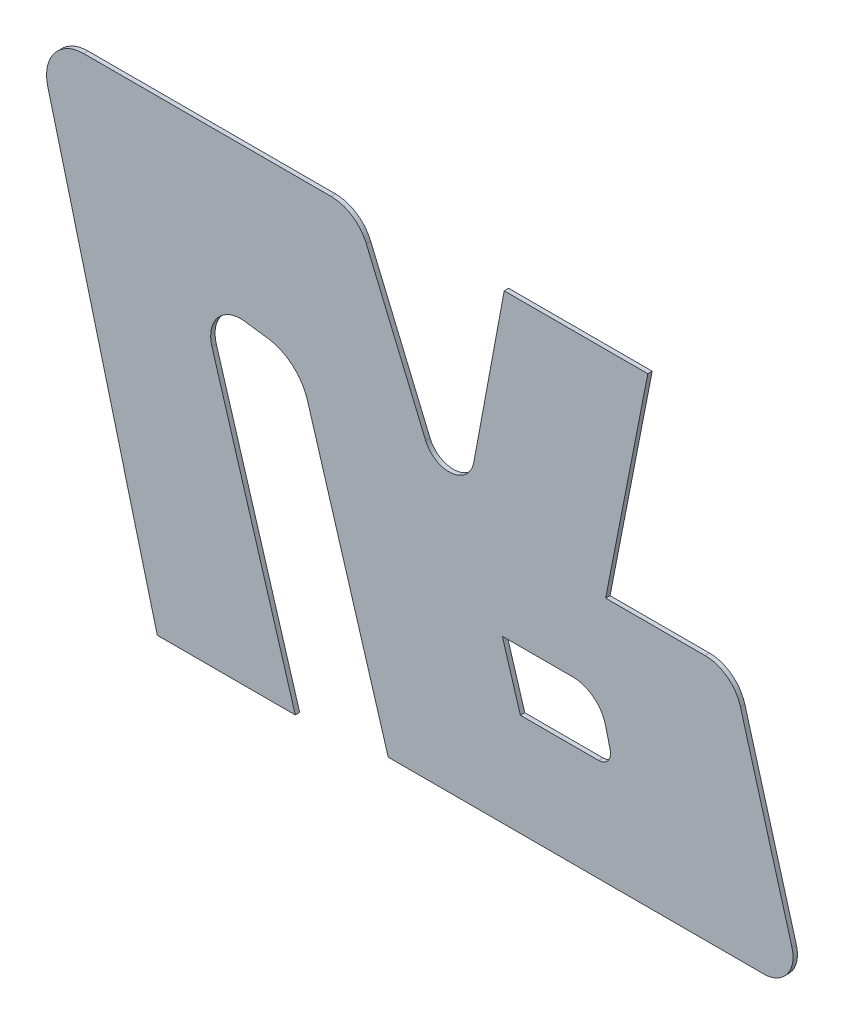
ISO-10303-21;
HEADER;
FILE_DESCRIPTION(('STEP AP214'),'2;1');
FILE_NAME('part.step','',(''),(''),'','','');
FILE_SCHEMA(('AUTOMOTIVE_DESIGN { 1 0 10303 214 1 1 1 1 }'));
ENDSEC;
DATA;
#1=APPLICATION_CONTEXT('core data for automotive mechanical design processes');
#2=APPLICATION_PROTOCOL_DEFINITION('international standard','automotive_design',2000,#1);
#3=PRODUCT_CONTEXT('',#1,'mechanical');
#4=PRODUCT('Part','Part','',(#3));
#5=PRODUCT_RELATED_PRODUCT_CATEGORY('part','',(#4));
#6=PRODUCT_DEFINITION_FORMATION('','',#4);
#7=PRODUCT_DEFINITION_CONTEXT('part definition',#1,'design');
#8=PRODUCT_DEFINITION('design','',#6,#7);
#9=PRODUCT_DEFINITION_SHAPE('','',#8);
#10=(LENGTH_UNIT() NAMED_UNIT(*) SI_UNIT(.MILLI.,.METRE.));
#11=(NAMED_UNIT(*) PLANE_ANGLE_UNIT() SI_UNIT($,.RADIAN.));
#12=(NAMED_UNIT(*) SI_UNIT($,.STERADIAN.) SOLID_ANGLE_UNIT());
#13=UNCERTAINTY_MEASURE_WITH_UNIT(LENGTH_MEASURE(1.E-05),#10,'distance_accuracy_value','');
#14=(GEOMETRIC_REPRESENTATION_CONTEXT(3) GLOBAL_UNCERTAINTY_ASSIGNED_CONTEXT((#13)) GLOBAL_UNIT_ASSIGNED_CONTEXT((#10,
#11,#12)) REPRESENTATION_CONTEXT('',''));
#15=CARTESIAN_POINT('',(0.,0.,0.));
#16=DIRECTION('',(0.,0.,1.));
#17=DIRECTION('',(1.,0.,0.));
#18=AXIS2_PLACEMENT_3D('',#15,#16,#17);
#19=CARTESIAN_POINT('',(4.051797180573,-20.65287619493,0.01));
#20=DIRECTION('',(0.,0.,1.));
#21=DIRECTION('',(1.,0.,0.));
#22=AXIS2_PLACEMENT_3D('',#19,#20,#21);
#23=PLANE('',#22);
#24=DIRECTION('',(0.291281051197872,-0.95663752237358,0.));
#25=VECTOR('',#24,1.);
#26=CARTESIAN_POINT('',(4.263261,-20.7761650451,0.01));
#27=LINE('',#26,#25);
#28=CARTESIAN_POINT('',(4.263261,-20.7761650451,0.01));
#29=VERTEX_POINT('',#28);
#30=CARTESIAN_POINT('',(4.304471,-20.91150866644,0.01));
#31=VERTEX_POINT('',#30);
#32=EDGE_CURVE('E480',#29,#31,#27,.T.);
#33=ORIENTED_EDGE('',*,*,#32,.F.);
#34=DIRECTION('',(-1.,0.,0.));
#35=VECTOR('',#34,1.);
#36=CARTESIAN_POINT('',(4.423673160377,-20.7761650451,0.01));
#37=LINE('',#36,#35);
#38=CARTESIAN_POINT('',(4.423673160377,-20.7761650451,0.01));
#39=VERTEX_POINT('',#38);
#40=EDGE_CURVE('E25',#39,#29,#37,.T.);
#41=ORIENTED_EDGE('',*,*,#40,.F.);
#42=CARTESIAN_POINT('',(4.423673160377,-20.85326269876,0.01));
#43=DIRECTION('',(0.,0.,1.));
#44=DIRECTION('',(1.,0.,0.));
#45=AXIS2_PLACEMENT_3D('',#42,#43,#44);
#46=CIRCLE('',#45,0.07709765366832);
#47=CARTESIAN_POINT('',(4.498580880247,-20.83501765272,0.01));
#48=VERTEX_POINT('',#47);
#49=EDGE_CURVE('E342',#48,#39,#46,.T.);
#50=ORIENTED_EDGE('',*,*,#49,.F.);
#51=DIRECTION('',(-0.236648525259099,0.971595324964408,0.));
#52=VECTOR('',#51,1.);
#53=CARTESIAN_POINT('',(4.509042708674,-20.87797022798,0.01));
#54=LINE('',#53,#52);
#55=CARTESIAN_POINT('',(4.509042708674,-20.87797022798,0.01));
#56=VERTEX_POINT('',#55);
#57=EDGE_CURVE('E317',#56,#48,#54,.T.);
#58=ORIENTED_EDGE('',*,*,#57,.F.);
#59=CARTESIAN_POINT('',(4.482692626702,-20.88438823749,0.01));
#60=DIRECTION('',(0.,0.,1.));
#61=DIRECTION('',(1.,0.,0.));
#62=AXIS2_PLACEMENT_3D('',#59,#60,#61);
#63=CIRCLE('',#62,0.02712042894327);
#64=CARTESIAN_POINT('',(4.482692626702,-20.91150866644,0.01));
#65=VERTEX_POINT('',#64);
#66=EDGE_CURVE('E467',#65,#56,#63,.T.);
#67=ORIENTED_EDGE('',*,*,#66,.F.);
#68=DIRECTION('',(1.,0.,0.));
#69=VECTOR('',#68,1.);
#70=CARTESIAN_POINT('',(4.304471,-20.91150866644,0.01));
#71=LINE('',#70,#69);
#72=EDGE_CURVE('E437',#31,#65,#71,.T.);
#73=ORIENTED_EDGE('',*,*,#72,.F.);
#74=EDGE_LOOP('',(#33,#41,#50,#58,#67,#73));
#75=FACE_BOUND('',#74,.T.);
#76=DIRECTION('',(-1.,0.,0.));
#77=VECTOR('',#76,1.);
#78=CARTESIAN_POINT('',(4.858859736031,-21.14473033957,0.01));
#79=LINE('',#78,#77);
#80=CARTESIAN_POINT('',(4.858859736031,-21.14473033957,0.01));
#81=VERTEX_POINT('',#80);
#82=CARTESIAN_POINT('',(4.0034259851,-21.14473033957,0.01));
#83=VERTEX_POINT('',#82);
#84=EDGE_CURVE('E259',#81,#83,#79,.T.);
#85=ORIENTED_EDGE('',*,*,#84,.F.);
#86=CARTESIAN_POINT('',(4.858859736031,-21.07809935626,0.01));
#87=DIRECTION('',(0.,0.,1.));
#88=DIRECTION('',(1.,0.,0.));
#89=AXIS2_PLACEMENT_3D('',#86,#87,#88);
#90=CIRCLE('',#89,0.06663098331158);
#91=CARTESIAN_POINT('',(4.922986354192,-21.0600033683,0.01));
#92=VERTEX_POINT('',#91);
#93=EDGE_CURVE('E245',#81,#92,#90,.T.);
#94=ORIENTED_EDGE('',*,*,#93,.T.);
#95=DIRECTION('',(0.271585185481092,-0.962414405039327,0.));
#96=VECTOR('',#95,1.);
#97=CARTESIAN_POINT('',(4.805642927588,-20.64417433882,0.01));
#98=LINE('',#97,#96);
#99=CARTESIAN_POINT('',(4.805642927588,-20.64417433882,0.01));
#100=VERTEX_POINT('',#99);
#101=EDGE_CURVE('E402',#100,#92,#98,.T.);
#102=ORIENTED_EDGE('',*,*,#101,.F.);
#103=CARTESIAN_POINT('',(4.725403453536,-20.66681723811,0.01));
#104=DIRECTION('',(0.,0.,1.));
#105=DIRECTION('',(1.,0.,0.));
#106=AXIS2_PLACEMENT_3D('',#103,#104,#105);
#107=CIRCLE('',#106,0.08337310168255);
#108=CARTESIAN_POINT('',(4.725403453536,-20.58344413642,0.01));
#109=VERTEX_POINT('',#108);
#110=EDGE_CURVE('E399',#100,#109,#107,.T.);
#111=ORIENTED_EDGE('',*,*,#110,.T.);
#112=DIRECTION('',(1.,0.,0.));
#113=VECTOR('',#112,1.);
#114=CARTESIAN_POINT('',(4.498684000567,-20.58344413642,0.01));
#115=LINE('',#114,#113);
#116=CARTESIAN_POINT('',(4.498684000567,-20.58344413642,0.01));
#117=VERTEX_POINT('',#116);
#118=EDGE_CURVE('E439',#117,#109,#115,.T.);
#119=ORIENTED_EDGE('',*,*,#118,.F.);
#120=DIRECTION('',(-0.192023873483029,-0.98139025469615,0.));
#121=VECTOR('',#120,1.);
#122=CARTESIAN_POINT('',(4.594708,-20.09268735941,0.01));
#123=LINE('',#122,#121);
#124=CARTESIAN_POINT('',(4.594708,-20.09268735941,0.01));
#125=VERTEX_POINT('',#124);
#126=EDGE_CURVE('E386',#125,#117,#123,.T.);
#127=ORIENTED_EDGE('',*,*,#126,.F.);
#128=DIRECTION('',(1.,0.,0.));
#129=VECTOR('',#128,1.);
#130=CARTESIAN_POINT('',(4.267588456474,-20.09268735941,0.01));
#131=LINE('',#130,#129);
#132=CARTESIAN_POINT('',(4.267588456474,-20.09268735941,0.01));
#133=VERTEX_POINT('',#132);
#134=EDGE_CURVE('E330',#133,#125,#131,.T.);
#135=ORIENTED_EDGE('',*,*,#134,.F.);
#136=DIRECTION('',(0.182443500043945,0.983216339007705,0.));
#137=VECTOR('',#136,1.);
#138=CARTESIAN_POINT('',(4.198398235758,-20.46556419795,0.01));
#139=LINE('',#138,#137);
#140=CARTESIAN_POINT('',(4.198398235758,-20.46556419795,0.01));
#141=VERTEX_POINT('',#140);
#142=EDGE_CURVE('E459',#141,#133,#139,.T.);
#143=ORIENTED_EDGE('',*,*,#142,.F.);
#144=CARTESIAN_POINT('',(4.141728982399,-20.4550487737,0.01));
#145=DIRECTION('',(0.,0.,1.));
#146=DIRECTION('',(1.,0.,0.));
#147=AXIS2_PLACEMENT_3D('',#144,#145,#146);
#148=CIRCLE('',#147,0.0576366066249);
#149=CARTESIAN_POINT('',(4.088620249938,-20.47744165113,0.01));
#150=VERTEX_POINT('',#149);
#151=EDGE_CURVE('E475',#150,#141,#148,.T.);
#152=ORIENTED_EDGE('',*,*,#151,.F.);
#153=DIRECTION('',(0.388518317471823,-0.921441000275581,0.));
#154=VECTOR('',#153,1.);
#155=CARTESIAN_POINT('',(3.953435343779,-20.15682635566,0.01));
#156=LINE('',#155,#154);
#157=CARTESIAN_POINT('',(3.953435343779,-20.15682635566,0.01));
#158=VERTEX_POINT('',#157);
#159=EDGE_CURVE('E290',#158,#150,#156,.T.);
#160=ORIENTED_EDGE('',*,*,#159,.F.);
#161=CARTESIAN_POINT('',(3.873276,-20.19062490962,0.01));
#162=DIRECTION('',(0.,0.,1.));
#163=DIRECTION('',(1.,0.,0.));
#164=AXIS2_PLACEMENT_3D('',#161,#162,#163);
#165=CIRCLE('',#164,0.08699346323296);
#166=CARTESIAN_POINT('',(3.873276,-20.10363144639,0.01));
#167=VERTEX_POINT('',#166);
#168=EDGE_CURVE('E295',#158,#167,#165,.T.);
#169=ORIENTED_EDGE('',*,*,#168,.T.);
#170=DIRECTION('',(1.,0.,0.));
#171=VECTOR('',#170,1.);
#172=CARTESIAN_POINT('',(3.309910350997,-20.10363144639,0.01));
#173=LINE('',#172,#171);
#174=CARTESIAN_POINT('',(3.309910350997,-20.10363144639,0.01));
#175=VERTEX_POINT('',#174);
#176=EDGE_CURVE('E303',#175,#167,#173,.T.);
#177=ORIENTED_EDGE('',*,*,#176,.F.);
#178=CARTESIAN_POINT('',(3.309910350997,-20.1882913801,0.01));
#179=DIRECTION('',(0.,0.,1.));
#180=DIRECTION('',(1.,0.,0.));
#181=AXIS2_PLACEMENT_3D('',#178,#179,#180);
#182=CIRCLE('',#181,0.08465993371356);
#183=CARTESIAN_POINT('',(3.227984430225,-20.20963260505,0.01));
#184=VERTEX_POINT('',#183);
#185=EDGE_CURVE('E427',#175,#184,#182,.T.);
#186=ORIENTED_EDGE('',*,*,#185,.T.);
#187=DIRECTION('',(-0.252081758232927,0.967705940441721,0.));
#188=VECTOR('',#187,1.);
#189=CARTESIAN_POINT('',(3.47744456929,-21.16727452317,0.01));
#190=LINE('',#189,#188);
#191=CARTESIAN_POINT('',(3.47744456929,-21.16727452317,0.01));
#192=VERTEX_POINT('',#191);
#193=EDGE_CURVE('E407',#192,#184,#190,.T.);
#194=ORIENTED_EDGE('',*,*,#193,.F.);
#195=DIRECTION('',(-1.,0.,0.));
#196=VECTOR('',#195,1.);
#197=CARTESIAN_POINT('',(3.791751562506,-21.16727452317,0.01));
#198=LINE('',#197,#196);
#199=CARTESIAN_POINT('',(3.791751562506,-21.16727452317,0.01));
#200=VERTEX_POINT('',#199);
#201=EDGE_CURVE('E390',#200,#192,#198,.T.);
#202=ORIENTED_EDGE('',*,*,#201,.F.);
#203=DIRECTION('',(0.287821717828985,-0.957684007773949,0.));
#204=VECTOR('',#203,1.);
#205=CARTESIAN_POINT('',(3.601936025805,-20.53569152346,0.01));
#206=LINE('',#205,#204);
#207=CARTESIAN_POINT('',(3.601936025805,-20.53569152346,0.01));
#208=VERTEX_POINT('',#207);
#209=EDGE_CURVE('E323',#208,#200,#206,.T.);
#210=ORIENTED_EDGE('',*,*,#209,.F.);
#211=CARTESIAN_POINT('',(3.667332871865,-20.51603719863,0.01));
#212=DIRECTION('',(0.,0.,1.));
#213=DIRECTION('',(1.,0.,0.));
#214=AXIS2_PLACEMENT_3D('',#211,#212,#213);
#215=CIRCLE('',#214,0.06828645516678);
#216=CARTESIAN_POINT('',(3.676559327276,-20.4483769261,0.01));
#217=VERTEX_POINT('',#216);
#218=EDGE_CURVE('E309',#217,#208,#215,.T.);
#219=ORIENTED_EDGE('',*,*,#218,.F.);
#220=DIRECTION('',(-0.990830060983024,0.135113989847003,0.));
#221=VECTOR('',#220,1.);
#222=CARTESIAN_POINT('',(3.728815951248,-20.45550287154,0.01));
#223=LINE('',#222,#221);
#224=CARTESIAN_POINT('',(3.728815951248,-20.45550287154,0.01));
#225=VERTEX_POINT('',#224);
#226=EDGE_CURVE('E349',#225,#217,#223,.T.);
#227=ORIENTED_EDGE('',*,*,#226,.F.);
#228=CARTESIAN_POINT('',(3.713902940337,-20.56486430427,0.01));
#229=DIRECTION('',(0.,0.,1.));
#230=DIRECTION('',(1.,0.,0.));
#231=AXIS2_PLACEMENT_3D('',#228,#229,#230);
#232=CIRCLE('',#231,0.110373551458);
#233=CARTESIAN_POINT('',(3.81960592545,-20.53309639908,0.01));
#234=VERTEX_POINT('',#233);
#235=EDGE_CURVE('E284',#234,#225,#232,.T.);
#236=ORIENTED_EDGE('',*,*,#235,.F.);
#237=DIRECTION('',(-0.287821717828985,0.957684007773949,0.));
#238=VECTOR('',#237,1.);
#239=CARTESIAN_POINT('',(4.0034259851,-21.14473033957,0.01));
#240=LINE('',#239,#238);
#241=EDGE_CURVE('E261',#83,#234,#240,.T.);
#242=ORIENTED_EDGE('',*,*,#241,.F.);
#243=EDGE_LOOP('',(#85,#94,#102,#111,#119,#127,#135,#143,#152,#160,#169,#177,#186,#194,#202,
#210,#219,#227,#236,#242));
#244=FACE_BOUND('',#243,.T.);
#245=ADVANCED_FACE('F17',(#75,#244),#23,.T.);
#246=CARTESIAN_POINT('',(4.051797180573,-20.65287619493,0.));
#247=DIRECTION('',(0.,0.,1.));
#248=DIRECTION('',(1.,0.,0.));
#249=AXIS2_PLACEMENT_3D('',#246,#247,#248);
#250=PLANE('',#249);
#251=DIRECTION('',(0.291281051197872,-0.95663752237358,0.));
#252=VECTOR('',#251,1.);
#253=CARTESIAN_POINT('',(4.263261,-20.7761650451,0.));
#254=LINE('',#253,#252);
#255=CARTESIAN_POINT('',(4.263261,-20.7761650451,0.));
#256=VERTEX_POINT('',#255);
#257=CARTESIAN_POINT('',(4.304471,-20.91150866644,0.));
#258=VERTEX_POINT('',#257);
#259=EDGE_CURVE('E433',#256,#258,#254,.T.);
#260=ORIENTED_EDGE('',*,*,#259,.T.);
#261=DIRECTION('',(1.,0.,0.));
#262=VECTOR('',#261,1.);
#263=CARTESIAN_POINT('',(4.304471,-20.91150866644,0.));
#264=LINE('',#263,#262);
#265=CARTESIAN_POINT('',(4.482692626702,-20.91150866644,0.));
#266=VERTEX_POINT('',#265);
#267=EDGE_CURVE('E522',#258,#266,#264,.T.);
#268=ORIENTED_EDGE('',*,*,#267,.T.);
#269=CARTESIAN_POINT('',(4.482692626702,-20.88438823749,0.));
#270=DIRECTION('',(0.,0.,1.));
#271=DIRECTION('',(1.,0.,0.));
#272=AXIS2_PLACEMENT_3D('',#269,#270,#271);
#273=CIRCLE('',#272,0.02712042894327);
#274=CARTESIAN_POINT('',(4.509042708674,-20.87797022798,0.));
#275=VERTEX_POINT('',#274);
#276=EDGE_CURVE('E451',#266,#275,#273,.T.);
#277=ORIENTED_EDGE('',*,*,#276,.T.);
#278=DIRECTION('',(-0.236648525259099,0.971595324964408,0.));
#279=VECTOR('',#278,1.);
#280=CARTESIAN_POINT('',(4.509042708674,-20.87797022798,0.));
#281=LINE('',#280,#279);
#282=CARTESIAN_POINT('',(4.498580880247,-20.83501765272,0.));
#283=VERTEX_POINT('',#282);
#284=EDGE_CURVE('E316',#275,#283,#281,.T.);
#285=ORIENTED_EDGE('',*,*,#284,.T.);
#286=CARTESIAN_POINT('',(4.423673160377,-20.85326269876,0.));
#287=DIRECTION('',(0.,0.,1.));
#288=DIRECTION('',(1.,0.,0.));
#289=AXIS2_PLACEMENT_3D('',#286,#287,#288);
#290=CIRCLE('',#289,0.07709765366832);
#291=CARTESIAN_POINT('',(4.423673160377,-20.7761650451,0.));
#292=VERTEX_POINT('',#291);
#293=EDGE_CURVE('E543',#283,#292,#290,.T.);
#294=ORIENTED_EDGE('',*,*,#293,.T.);
#295=DIRECTION('',(-1.,0.,0.));
#296=VECTOR('',#295,1.);
#297=CARTESIAN_POINT('',(4.423673160377,-20.7761650451,0.));
#298=LINE('',#297,#296);
#299=EDGE_CURVE('E11',#292,#256,#298,.T.);
#300=ORIENTED_EDGE('',*,*,#299,.T.);
#301=EDGE_LOOP('',(#260,#268,#277,#285,#294,#300));
#302=FACE_BOUND('',#301,.T.);
#303=DIRECTION('',(-1.,0.,0.));
#304=VECTOR('',#303,1.);
#305=CARTESIAN_POINT('',(4.858859736031,-21.14473033957,0.));
#306=LINE('',#305,#304);
#307=CARTESIAN_POINT('',(4.858859736031,-21.14473033957,0.));
#308=VERTEX_POINT('',#307);
#309=CARTESIAN_POINT('',(4.0034259851,-21.14473033957,0.));
#310=VERTEX_POINT('',#309);
#311=EDGE_CURVE('E271',#308,#310,#306,.T.);
#312=ORIENTED_EDGE('',*,*,#311,.T.);
#313=DIRECTION('',(-0.287821717828985,0.957684007773949,0.));
#314=VECTOR('',#313,1.);
#315=CARTESIAN_POINT('',(4.0034259851,-21.14473033957,0.));
#316=LINE('',#315,#314);
#317=CARTESIAN_POINT('',(3.81960592545,-20.53309639908,0.));
#318=VERTEX_POINT('',#317);
#319=EDGE_CURVE('E281',#310,#318,#316,.T.);
#320=ORIENTED_EDGE('',*,*,#319,.T.);
#321=CARTESIAN_POINT('',(3.713902940337,-20.56486430427,0.));
#322=DIRECTION('',(0.,0.,1.));
#323=DIRECTION('',(1.,0.,0.));
#324=AXIS2_PLACEMENT_3D('',#321,#322,#323);
#325=CIRCLE('',#324,0.110373551458);
#326=CARTESIAN_POINT('',(3.728815951248,-20.45550287154,0.));
#327=VERTEX_POINT('',#326);
#328=EDGE_CURVE('E322',#318,#327,#325,.T.);
#329=ORIENTED_EDGE('',*,*,#328,.T.);
#330=DIRECTION('',(-0.990830060983024,0.135113989847003,0.));
#331=VECTOR('',#330,1.);
#332=CARTESIAN_POINT('',(3.728815951248,-20.45550287154,0.));
#333=LINE('',#332,#331);
#334=CARTESIAN_POINT('',(3.676559327276,-20.4483769261,0.));
#335=VERTEX_POINT('',#334);
#336=EDGE_CURVE('E370',#327,#335,#333,.T.);
#337=ORIENTED_EDGE('',*,*,#336,.T.);
#338=CARTESIAN_POINT('',(3.667332871865,-20.51603719863,0.));
#339=DIRECTION('',(0.,0.,1.));
#340=DIRECTION('',(1.,0.,0.));
#341=AXIS2_PLACEMENT_3D('',#338,#339,#340);
#342=CIRCLE('',#341,0.06828645516678);
#343=CARTESIAN_POINT('',(3.601936025805,-20.53569152346,0.));
#344=VERTEX_POINT('',#343);
#345=EDGE_CURVE('E308',#335,#344,#342,.T.);
#346=ORIENTED_EDGE('',*,*,#345,.T.);
#347=DIRECTION('',(0.287821717828985,-0.957684007773949,0.));
#348=VECTOR('',#347,1.);
#349=CARTESIAN_POINT('',(3.601936025805,-20.53569152346,0.));
#350=LINE('',#349,#348);
#351=CARTESIAN_POINT('',(3.791751562506,-21.16727452317,0.));
#352=VERTEX_POINT('',#351);
#353=EDGE_CURVE('E380',#344,#352,#350,.T.);
#354=ORIENTED_EDGE('',*,*,#353,.T.);
#355=DIRECTION('',(-1.,0.,0.));
#356=VECTOR('',#355,1.);
#357=CARTESIAN_POINT('',(3.791751562506,-21.16727452317,0.));
#358=LINE('',#357,#356);
#359=CARTESIAN_POINT('',(3.47744456929,-21.16727452317,0.));
#360=VERTEX_POINT('',#359);
#361=EDGE_CURVE('E398',#352,#360,#358,.T.);
#362=ORIENTED_EDGE('',*,*,#361,.T.);
#363=DIRECTION('',(-0.252081758232927,0.967705940441721,0.));
#364=VECTOR('',#363,1.);
#365=CARTESIAN_POINT('',(3.47744456929,-21.16727452317,0.));
#366=LINE('',#365,#364);
#367=CARTESIAN_POINT('',(3.227984430225,-20.20963260505,0.));
#368=VERTEX_POINT('',#367);
#369=EDGE_CURVE('E415',#360,#368,#366,.T.);
#370=ORIENTED_EDGE('',*,*,#369,.T.);
#371=CARTESIAN_POINT('',(3.309910350997,-20.1882913801,0.));
#372=DIRECTION('',(0.,0.,1.));
#373=DIRECTION('',(1.,0.,0.));
#374=AXIS2_PLACEMENT_3D('',#371,#372,#373);
#375=CIRCLE('',#374,0.08465993371356);
#376=CARTESIAN_POINT('',(3.309910350997,-20.10363144639,0.));
#377=VERTEX_POINT('',#376);
#378=EDGE_CURVE('E279',#377,#368,#375,.T.);
#379=ORIENTED_EDGE('',*,*,#378,.F.);
#380=DIRECTION('',(1.,0.,0.));
#381=VECTOR('',#380,1.);
#382=CARTESIAN_POINT('',(3.309910350997,-20.10363144639,0.));
#383=LINE('',#382,#381);
#384=CARTESIAN_POINT('',(3.873276,-20.10363144639,0.));
#385=VERTEX_POINT('',#384);
#386=EDGE_CURVE('E302',#377,#385,#383,.T.);
#387=ORIENTED_EDGE('',*,*,#386,.T.);
#388=CARTESIAN_POINT('',(3.873276,-20.19062490962,0.));
#389=DIRECTION('',(0.,0.,1.));
#390=DIRECTION('',(1.,0.,0.));
#391=AXIS2_PLACEMENT_3D('',#388,#389,#390);
#392=CIRCLE('',#391,0.08699346323296);
#393=CARTESIAN_POINT('',(3.953435343779,-20.15682635566,0.));
#394=VERTEX_POINT('',#393);
#395=EDGE_CURVE('E450',#394,#385,#392,.T.);
#396=ORIENTED_EDGE('',*,*,#395,.F.);
#397=DIRECTION('',(0.388518317471823,-0.921441000275581,0.));
#398=VECTOR('',#397,1.);
#399=CARTESIAN_POINT('',(3.953435343779,-20.15682635566,0.));
#400=LINE('',#399,#398);
#401=CARTESIAN_POINT('',(4.088620249938,-20.47744165113,0.));
#402=VERTEX_POINT('',#401);
#403=EDGE_CURVE('E471',#394,#402,#400,.T.);
#404=ORIENTED_EDGE('',*,*,#403,.T.);
#405=CARTESIAN_POINT('',(4.141728982399,-20.4550487737,0.));
#406=DIRECTION('',(0.,0.,1.));
#407=DIRECTION('',(1.,0.,0.));
#408=AXIS2_PLACEMENT_3D('',#405,#406,#407);
#409=CIRCLE('',#408,0.0576366066249);
#410=CARTESIAN_POINT('',(4.198398235758,-20.46556419795,0.));
#411=VERTEX_POINT('',#410);
#412=EDGE_CURVE('E487',#402,#411,#409,.T.);
#413=ORIENTED_EDGE('',*,*,#412,.T.);
#414=DIRECTION('',(0.182443500043945,0.983216339007705,0.));
#415=VECTOR('',#414,1.);
#416=CARTESIAN_POINT('',(4.198398235758,-20.46556419795,0.));
#417=LINE('',#416,#415);
#418=CARTESIAN_POINT('',(4.267588456474,-20.09268735941,0.));
#419=VERTEX_POINT('',#418);
#420=EDGE_CURVE('E335',#411,#419,#417,.T.);
#421=ORIENTED_EDGE('',*,*,#420,.T.);
#422=DIRECTION('',(1.,0.,0.));
#423=VECTOR('',#422,1.);
#424=CARTESIAN_POINT('',(4.267588456474,-20.09268735941,0.));
#425=LINE('',#424,#423);
#426=CARTESIAN_POINT('',(4.594708,-20.09268735941,0.));
#427=VERTEX_POINT('',#426);
#428=EDGE_CURVE('E497',#419,#427,#425,.T.);
#429=ORIENTED_EDGE('',*,*,#428,.T.);
#430=DIRECTION('',(-0.192023873483029,-0.98139025469615,0.));
#431=VECTOR('',#430,1.);
#432=CARTESIAN_POINT('',(4.594708,-20.09268735941,0.));
#433=LINE('',#432,#431);
#434=CARTESIAN_POINT('',(4.498684000567,-20.58344413642,0.));
#435=VERTEX_POINT('',#434);
#436=EDGE_CURVE('E385',#427,#435,#433,.T.);
#437=ORIENTED_EDGE('',*,*,#436,.T.);
#438=DIRECTION('',(1.,0.,0.));
#439=VECTOR('',#438,1.);
#440=CARTESIAN_POINT('',(4.498684000567,-20.58344413642,0.));
#441=LINE('',#440,#439);
#442=CARTESIAN_POINT('',(4.725403453536,-20.58344413642,0.));
#443=VERTEX_POINT('',#442);
#444=EDGE_CURVE('E361',#435,#443,#441,.T.);
#445=ORIENTED_EDGE('',*,*,#444,.T.);
#446=CARTESIAN_POINT('',(4.725403453536,-20.66681723811,0.));
#447=DIRECTION('',(0.,0.,1.));
#448=DIRECTION('',(1.,0.,0.));
#449=AXIS2_PLACEMENT_3D('',#446,#447,#448);
#450=CIRCLE('',#449,0.08337310168255);
#451=CARTESIAN_POINT('',(4.805642927588,-20.64417433882,0.));
#452=VERTEX_POINT('',#451);
#453=EDGE_CURVE('E403',#452,#443,#450,.T.);
#454=ORIENTED_EDGE('',*,*,#453,.F.);
#455=DIRECTION('',(0.271585185481092,-0.962414405039327,0.));
#456=VECTOR('',#455,1.);
#457=CARTESIAN_POINT('',(4.805642927588,-20.64417433882,0.));
#458=LINE('',#457,#456);
#459=CARTESIAN_POINT('',(4.922986354192,-21.0600033683,0.));
#460=VERTEX_POINT('',#459);
#461=EDGE_CURVE('E286',#452,#460,#458,.T.);
#462=ORIENTED_EDGE('',*,*,#461,.T.);
#463=CARTESIAN_POINT('',(4.858859736031,-21.07809935626,0.));
#464=DIRECTION('',(0.,0.,1.));
#465=DIRECTION('',(1.,0.,0.));
#466=AXIS2_PLACEMENT_3D('',#463,#464,#465);
#467=CIRCLE('',#466,0.06663098331158);
#468=EDGE_CURVE('E256',#308,#460,#467,.T.);
#469=ORIENTED_EDGE('',*,*,#468,.F.);
#470=EDGE_LOOP('',(#312,#320,#329,#337,#346,#354,#362,#370,#379,#387,#396,#404,#413,#421,#429,
#437,#445,#454,#462,#469));
#471=FACE_BOUND('',#470,.T.);
#472=ADVANCED_FACE('F555',(#302,#471),#250,.F.);
#473=CARTESIAN_POINT('',(4.423673160377,-20.7761650451,0.));
#474=DIRECTION('',(0.,-1.,0.));
#475=DIRECTION('',(0.,0.,-1.));
#476=AXIS2_PLACEMENT_3D('',#473,#474,#475);
#477=PLANE('',#476);
#478=DIRECTION('',(0.,0.,1.));
#479=VECTOR('',#478,1.);
#480=CARTESIAN_POINT('',(4.423673160377,-20.7761650451,0.));
#481=LINE('',#480,#479);
#482=EDGE_CURVE('E426',#292,#39,#481,.T.);
#483=ORIENTED_EDGE('',*,*,#482,.T.);
#484=ORIENTED_EDGE('',*,*,#40,.T.);
#485=DIRECTION('',(0.,0.,1.));
#486=VECTOR('',#485,1.);
#487=CARTESIAN_POINT('',(4.263261,-20.7761650451,0.));
#488=LINE('',#487,#486);
#489=EDGE_CURVE('E255',#256,#29,#488,.T.);
#490=ORIENTED_EDGE('',*,*,#489,.F.);
#491=ORIENTED_EDGE('',*,*,#299,.F.);
#492=EDGE_LOOP('',(#483,#484,#490,#491));
#493=FACE_BOUND('',#492,.T.);
#494=ADVANCED_FACE('F547',(#493),#477,.T.);
#495=CARTESIAN_POINT('',(4.423673160377,-20.85326269876,0.));
#496=DIRECTION('',(0.,0.,-1.));
#497=DIRECTION('',(1.,0.,0.));
#498=AXIS2_PLACEMENT_3D('',#495,#496,#497);
#499=CYLINDRICAL_SURFACE('',#498,0.07709765366832);
#500=DIRECTION('',(0.,0.,1.));
#501=VECTOR('',#500,1.);
#502=CARTESIAN_POINT('',(4.498580880247,-20.83501765272,0.));
#503=LINE('',#502,#501);
#504=EDGE_CURVE('E312',#283,#48,#503,.T.);
#505=ORIENTED_EDGE('',*,*,#504,.T.);
#506=ORIENTED_EDGE('',*,*,#49,.T.);
#507=ORIENTED_EDGE('',*,*,#482,.F.);
#508=ORIENTED_EDGE('',*,*,#293,.F.);
#509=EDGE_LOOP('',(#505,#506,#507,#508));
#510=FACE_BOUND('',#509,.T.);
#511=ADVANCED_FACE('F560',(#510),#499,.F.);
#512=CARTESIAN_POINT('',(4.509042708674,-20.87797022798,0.));
#513=DIRECTION('',(-0.971595324964408,-0.236648525259099,0.));
#514=DIRECTION('',(-0.236648525259099,0.971595324964408,0.));
#515=AXIS2_PLACEMENT_3D('',#512,#513,#514);
#516=PLANE('',#515);
#517=DIRECTION('',(0.,0.,1.));
#518=VECTOR('',#517,1.);
#519=CARTESIAN_POINT('',(4.509042708674,-20.87797022798,0.));
#520=LINE('',#519,#518);
#521=EDGE_CURVE('E455',#275,#56,#520,.T.);
#522=ORIENTED_EDGE('',*,*,#521,.T.);
#523=ORIENTED_EDGE('',*,*,#57,.T.);
#524=ORIENTED_EDGE('',*,*,#504,.F.);
#525=ORIENTED_EDGE('',*,*,#284,.F.);
#526=EDGE_LOOP('',(#522,#523,#524,#525));
#527=FACE_BOUND('',#526,.T.);
#528=ADVANCED_FACE('F563',(#527),#516,.T.);
#529=CARTESIAN_POINT('',(4.482692626702,-20.88438823749,0.));
#530=DIRECTION('',(0.,0.,-1.));
#531=DIRECTION('',(1.,0.,0.));
#532=AXIS2_PLACEMENT_3D('',#529,#530,#531);
#533=CYLINDRICAL_SURFACE('',#532,0.02712042894327);
#534=DIRECTION('',(0.,0.,1.));
#535=VECTOR('',#534,1.);
#536=CARTESIAN_POINT('',(4.482692626702,-20.91150866644,0.));
#537=LINE('',#536,#535);
#538=EDGE_CURVE('E534',#266,#65,#537,.T.);
#539=ORIENTED_EDGE('',*,*,#538,.T.);
#540=ORIENTED_EDGE('',*,*,#66,.T.);
#541=ORIENTED_EDGE('',*,*,#521,.F.);
#542=ORIENTED_EDGE('',*,*,#276,.F.);
#543=EDGE_LOOP('',(#539,#540,#541,#542));
#544=FACE_BOUND('',#543,.T.);
#545=ADVANCED_FACE('F565',(#544),#533,.F.);
#546=CARTESIAN_POINT('',(4.304471,-20.91150866644,0.));
#547=DIRECTION('',(0.,1.,0.));
#548=DIRECTION('',(1.,0.,0.));
#549=AXIS2_PLACEMENT_3D('',#546,#547,#548);
#550=PLANE('',#549);
#551=DIRECTION('',(0.,0.,1.));
#552=VECTOR('',#551,1.);
#553=CARTESIAN_POINT('',(4.304471,-20.91150866644,0.));
#554=LINE('',#553,#552);
#555=EDGE_CURVE('E438',#258,#31,#554,.T.);
#556=ORIENTED_EDGE('',*,*,#555,.T.);
#557=ORIENTED_EDGE('',*,*,#72,.T.);
#558=ORIENTED_EDGE('',*,*,#538,.F.);
#559=ORIENTED_EDGE('',*,*,#267,.F.);
#560=EDGE_LOOP('',(#556,#557,#558,#559));
#561=FACE_BOUND('',#560,.T.);
#562=ADVANCED_FACE('F567',(#561),#550,.T.);
#563=CARTESIAN_POINT('',(4.263261,-20.7761650451,0.));
#564=DIRECTION('',(0.95663752237358,0.291281051197872,0.));
#565=DIRECTION('',(0.,0.,-1.));
#566=AXIS2_PLACEMENT_3D('',#563,#564,#565);
#567=PLANE('',#566);
#568=ORIENTED_EDGE('',*,*,#489,.T.);
#569=ORIENTED_EDGE('',*,*,#32,.T.);
#570=ORIENTED_EDGE('',*,*,#555,.F.);
#571=ORIENTED_EDGE('',*,*,#259,.F.);
#572=EDGE_LOOP('',(#568,#569,#570,#571));
#573=FACE_BOUND('',#572,.T.);
#574=ADVANCED_FACE('F552',(#573),#567,.T.);
#575=CARTESIAN_POINT('',(4.858859736031,-21.07809935626,0.));
#576=DIRECTION('',(0.,0.,-1.));
#577=DIRECTION('',(1.,0.,0.));
#578=AXIS2_PLACEMENT_3D('',#575,#576,#577);
#579=CYLINDRICAL_SURFACE('',#578,0.06663098331158);
#580=DIRECTION('',(0.,0.,1.));
#581=VECTOR('',#580,1.);
#582=CARTESIAN_POINT('',(4.858859736031,-21.14473033957,0.));
#583=LINE('',#582,#581);
#584=EDGE_CURVE('E249',#308,#81,#583,.T.);
#585=ORIENTED_EDGE('',*,*,#584,.F.);
#586=ORIENTED_EDGE('',*,*,#468,.T.);
#587=DIRECTION('',(0.,0.,1.));
#588=VECTOR('',#587,1.);
#589=CARTESIAN_POINT('',(4.922986354192,-21.0600033683,0.));
#590=LINE('',#589,#588);
#591=EDGE_CURVE('E251',#460,#92,#590,.T.);
#592=ORIENTED_EDGE('',*,*,#591,.T.);
#593=ORIENTED_EDGE('',*,*,#93,.F.);
#594=EDGE_LOOP('',(#585,#586,#592,#593));
#595=FACE_BOUND('',#594,.T.);
#596=ADVANCED_FACE('F247',(#595),#579,.T.);
#597=CARTESIAN_POINT('',(4.805642927588,-20.64417433882,0.));
#598=DIRECTION('',(0.962414405039327,0.271585185481092,0.));
#599=DIRECTION('',(0.,0.,-1.));
#600=AXIS2_PLACEMENT_3D('',#597,#598,#599);
#601=PLANE('',#600);
#602=DIRECTION('',(0.,0.,1.));
#603=VECTOR('',#602,1.);
#604=CARTESIAN_POINT('',(4.805642927588,-20.64417433882,0.));
#605=LINE('',#604,#603);
#606=EDGE_CURVE('E365',#452,#100,#605,.T.);
#607=ORIENTED_EDGE('',*,*,#606,.T.);
#608=ORIENTED_EDGE('',*,*,#101,.T.);
#609=ORIENTED_EDGE('',*,*,#591,.F.);
#610=ORIENTED_EDGE('',*,*,#461,.F.);
#611=EDGE_LOOP('',(#607,#608,#609,#610));
#612=FACE_BOUND('',#611,.T.);
#613=ADVANCED_FACE('F614',(#612),#601,.T.);
#614=CARTESIAN_POINT('',(4.725403453536,-20.66681723811,0.));
#615=DIRECTION('',(0.,0.,-1.));
#616=DIRECTION('',(1.,0.,0.));
#617=AXIS2_PLACEMENT_3D('',#614,#615,#616);
#618=CYLINDRICAL_SURFACE('',#617,0.08337310168255);
#619=ORIENTED_EDGE('',*,*,#606,.F.);
#620=ORIENTED_EDGE('',*,*,#453,.T.);
#621=DIRECTION('',(0.,0.,1.));
#622=VECTOR('',#621,1.);
#623=CARTESIAN_POINT('',(4.725403453536,-20.58344413642,0.));
#624=LINE('',#623,#622);
#625=EDGE_CURVE('E366',#443,#109,#624,.T.);
#626=ORIENTED_EDGE('',*,*,#625,.T.);
#627=ORIENTED_EDGE('',*,*,#110,.F.);
#628=EDGE_LOOP('',(#619,#620,#626,#627));
#629=FACE_BOUND('',#628,.T.);
#630=ADVANCED_FACE('F612',(#629),#618,.T.);
#631=CARTESIAN_POINT('',(4.498684000567,-20.58344413642,0.));
#632=DIRECTION('',(0.,1.,0.));
#633=DIRECTION('',(1.,0.,0.));
#634=AXIS2_PLACEMENT_3D('',#631,#632,#633);
#635=PLANE('',#634);
#636=DIRECTION('',(0.,0.,1.));
#637=VECTOR('',#636,1.);
#638=CARTESIAN_POINT('',(4.498684000567,-20.58344413642,0.));
#639=LINE('',#638,#637);
#640=EDGE_CURVE('E381',#435,#117,#639,.T.);
#641=ORIENTED_EDGE('',*,*,#640,.T.);
#642=ORIENTED_EDGE('',*,*,#118,.T.);
#643=ORIENTED_EDGE('',*,*,#625,.F.);
#644=ORIENTED_EDGE('',*,*,#444,.F.);
#645=EDGE_LOOP('',(#641,#642,#643,#644));
#646=FACE_BOUND('',#645,.T.);
#647=ADVANCED_FACE('F609',(#646),#635,.T.);
#648=CARTESIAN_POINT('',(4.594708,-20.09268735941,0.));
#649=DIRECTION('',(0.98139025469615,-0.192023873483029,0.));
#650=DIRECTION('',(0.,0.,-1.));
#651=AXIS2_PLACEMENT_3D('',#648,#649,#650);
#652=PLANE('',#651);
#653=DIRECTION('',(0.,0.,1.));
#654=VECTOR('',#653,1.);
#655=CARTESIAN_POINT('',(4.594708,-20.09268735941,0.));
#656=LINE('',#655,#654);
#657=EDGE_CURVE('E334',#427,#125,#656,.T.);
#658=ORIENTED_EDGE('',*,*,#657,.T.);
#659=ORIENTED_EDGE('',*,*,#126,.T.);
#660=ORIENTED_EDGE('',*,*,#640,.F.);
#661=ORIENTED_EDGE('',*,*,#436,.F.);
#662=EDGE_LOOP('',(#658,#659,#660,#661));
#663=FACE_BOUND('',#662,.T.);
#664=ADVANCED_FACE('F603',(#663),#652,.T.);
#665=CARTESIAN_POINT('',(4.267588456474,-20.09268735941,0.));
#666=DIRECTION('',(0.,1.,0.));
#667=DIRECTION('',(1.,0.,0.));
#668=AXIS2_PLACEMENT_3D('',#665,#666,#667);
#669=PLANE('',#668);
#670=DIRECTION('',(0.,0.,1.));
#671=VECTOR('',#670,1.);
#672=CARTESIAN_POINT('',(4.267588456474,-20.09268735941,0.));
#673=LINE('',#672,#671);
#674=EDGE_CURVE('E356',#419,#133,#673,.T.);
#675=ORIENTED_EDGE('',*,*,#674,.T.);
#676=ORIENTED_EDGE('',*,*,#134,.T.);
#677=ORIENTED_EDGE('',*,*,#657,.F.);
#678=ORIENTED_EDGE('',*,*,#428,.F.);
#679=EDGE_LOOP('',(#675,#676,#677,#678));
#680=FACE_BOUND('',#679,.T.);
#681=ADVANCED_FACE('F601',(#680),#669,.T.);
#682=CARTESIAN_POINT('',(4.198398235758,-20.46556419795,0.));
#683=DIRECTION('',(-0.983216339007705,0.182443500043945,0.));
#684=DIRECTION('',(0.,0.,1.));
#685=AXIS2_PLACEMENT_3D('',#682,#683,#684);
#686=PLANE('',#685);
#687=DIRECTION('',(0.,0.,1.));
#688=VECTOR('',#687,1.);
#689=CARTESIAN_POINT('',(4.198398235758,-20.46556419795,0.));
#690=LINE('',#689,#688);
#691=EDGE_CURVE('E479',#411,#141,#690,.T.);
#692=ORIENTED_EDGE('',*,*,#691,.T.);
#693=ORIENTED_EDGE('',*,*,#142,.T.);
#694=ORIENTED_EDGE('',*,*,#674,.F.);
#695=ORIENTED_EDGE('',*,*,#420,.F.);
#696=EDGE_LOOP('',(#692,#693,#694,#695));
#697=FACE_BOUND('',#696,.T.);
#698=ADVANCED_FACE('F599',(#697),#686,.T.);
#699=CARTESIAN_POINT('',(4.141728982399,-20.4550487737,0.));
#700=DIRECTION('',(0.,0.,-1.));
#701=DIRECTION('',(1.,0.,0.));
#702=AXIS2_PLACEMENT_3D('',#699,#700,#701);
#703=CYLINDRICAL_SURFACE('',#702,0.0576366066249);
#704=DIRECTION('',(0.,0.,1.));
#705=VECTOR('',#704,1.);
#706=CARTESIAN_POINT('',(4.088620249938,-20.47744165113,0.));
#707=LINE('',#706,#705);
#708=EDGE_CURVE('E294',#402,#150,#707,.T.);
#709=ORIENTED_EDGE('',*,*,#708,.T.);
#710=ORIENTED_EDGE('',*,*,#151,.T.);
#711=ORIENTED_EDGE('',*,*,#691,.F.);
#712=ORIENTED_EDGE('',*,*,#412,.F.);
#713=EDGE_LOOP('',(#709,#710,#711,#712));
#714=FACE_BOUND('',#713,.T.);
#715=ADVANCED_FACE('F594',(#714),#703,.F.);
#716=CARTESIAN_POINT('',(3.953435343779,-20.15682635566,0.));
#717=DIRECTION('',(0.921441000275581,0.388518317471823,0.));
#718=DIRECTION('',(0.,0.,-1.));
#719=AXIS2_PLACEMENT_3D('',#716,#717,#718);
#720=PLANE('',#719);
#721=DIRECTION('',(0.,0.,1.));
#722=VECTOR('',#721,1.);
#723=CARTESIAN_POINT('',(3.953435343779,-20.15682635566,0.));
#724=LINE('',#723,#722);
#725=EDGE_CURVE('E446',#394,#158,#724,.T.);
#726=ORIENTED_EDGE('',*,*,#725,.T.);
#727=ORIENTED_EDGE('',*,*,#159,.T.);
#728=ORIENTED_EDGE('',*,*,#708,.F.);
#729=ORIENTED_EDGE('',*,*,#403,.F.);
#730=EDGE_LOOP('',(#726,#727,#728,#729));
#731=FACE_BOUND('',#730,.T.);
#732=ADVANCED_FACE('F592',(#731),#720,.T.);
#733=CARTESIAN_POINT('',(3.873276,-20.19062490962,0.));
#734=DIRECTION('',(0.,0.,-1.));
#735=DIRECTION('',(1.,0.,0.));
#736=AXIS2_PLACEMENT_3D('',#733,#734,#735);
#737=CYLINDRICAL_SURFACE('',#736,0.08699346323296);
#738=ORIENTED_EDGE('',*,*,#725,.F.);
#739=ORIENTED_EDGE('',*,*,#395,.T.);
#740=DIRECTION('',(0.,0.,1.));
#741=VECTOR('',#740,1.);
#742=CARTESIAN_POINT('',(3.873276,-20.10363144639,0.));
#743=LINE('',#742,#741);
#744=EDGE_CURVE('E298',#385,#167,#743,.T.);
#745=ORIENTED_EDGE('',*,*,#744,.T.);
#746=ORIENTED_EDGE('',*,*,#168,.F.);
#747=EDGE_LOOP('',(#738,#739,#745,#746));
#748=FACE_BOUND('',#747,.T.);
#749=ADVANCED_FACE('F590',(#748),#737,.T.);
#750=CARTESIAN_POINT('',(3.309910350997,-20.10363144639,0.));
#751=DIRECTION('',(0.,1.,0.));
#752=DIRECTION('',(1.,0.,0.));
#753=AXIS2_PLACEMENT_3D('',#750,#751,#752);
#754=PLANE('',#753);
#755=DIRECTION('',(0.,0.,1.));
#756=VECTOR('',#755,1.);
#757=CARTESIAN_POINT('',(3.309910350997,-20.10363144639,0.));
#758=LINE('',#757,#756);
#759=EDGE_CURVE('E419',#377,#175,#758,.T.);
#760=ORIENTED_EDGE('',*,*,#759,.T.);
#761=ORIENTED_EDGE('',*,*,#176,.T.);
#762=ORIENTED_EDGE('',*,*,#744,.F.);
#763=ORIENTED_EDGE('',*,*,#386,.F.);
#764=EDGE_LOOP('',(#760,#761,#762,#763));
#765=FACE_BOUND('',#764,.T.);
#766=ADVANCED_FACE('F583',(#765),#754,.T.);
#767=CARTESIAN_POINT('',(3.309910350997,-20.1882913801,0.));
#768=DIRECTION('',(0.,0.,-1.));
#769=DIRECTION('',(-0.79122745096372,0.611521970857511,0.));
#770=AXIS2_PLACEMENT_3D('',#767,#768,#769);
#771=CYLINDRICAL_SURFACE('',#770,0.08465993371356);
#772=ORIENTED_EDGE('',*,*,#759,.F.);
#773=ORIENTED_EDGE('',*,*,#378,.T.);
#774=DIRECTION('',(0.,0.,1.));
#775=VECTOR('',#774,1.);
#776=CARTESIAN_POINT('',(3.227984430225,-20.20963260505,0.));
#777=LINE('',#776,#775);
#778=EDGE_CURVE('E411',#368,#184,#777,.T.);
#779=ORIENTED_EDGE('',*,*,#778,.T.);
#780=ORIENTED_EDGE('',*,*,#185,.F.);
#781=EDGE_LOOP('',(#772,#773,#779,#780));
#782=FACE_BOUND('',#781,.T.);
#783=ADVANCED_FACE('F576',(#782),#771,.T.);
#784=CARTESIAN_POINT('',(3.47744456929,-21.16727452317,0.));
#785=DIRECTION('',(-0.967705940441721,-0.252081758232927,0.));
#786=DIRECTION('',(-0.252081758232927,0.967705940441721,0.));
#787=AXIS2_PLACEMENT_3D('',#784,#785,#786);
#788=PLANE('',#787);
#789=DIRECTION('',(0.,0.,1.));
#790=VECTOR('',#789,1.);
#791=CARTESIAN_POINT('',(3.47744456929,-21.16727452317,0.));
#792=LINE('',#791,#790);
#793=EDGE_CURVE('E394',#360,#192,#792,.T.);
#794=ORIENTED_EDGE('',*,*,#793,.T.);
#795=ORIENTED_EDGE('',*,*,#193,.T.);
#796=ORIENTED_EDGE('',*,*,#778,.F.);
#797=ORIENTED_EDGE('',*,*,#369,.F.);
#798=EDGE_LOOP('',(#794,#795,#796,#797));
#799=FACE_BOUND('',#798,.T.);
#800=ADVANCED_FACE('F581',(#799),#788,.T.);
#801=CARTESIAN_POINT('',(3.791751562506,-21.16727452317,0.));
#802=DIRECTION('',(0.,-1.,0.));
#803=DIRECTION('',(0.,0.,-1.));
#804=AXIS2_PLACEMENT_3D('',#801,#802,#803);
#805=PLANE('',#804);
#806=DIRECTION('',(0.,0.,1.));
#807=VECTOR('',#806,1.);
#808=CARTESIAN_POINT('',(3.791751562506,-21.16727452317,0.));
#809=LINE('',#808,#807);
#810=EDGE_CURVE('E327',#352,#200,#809,.T.);
#811=ORIENTED_EDGE('',*,*,#810,.T.);
#812=ORIENTED_EDGE('',*,*,#201,.T.);
#813=ORIENTED_EDGE('',*,*,#793,.F.);
#814=ORIENTED_EDGE('',*,*,#361,.F.);
#815=EDGE_LOOP('',(#811,#812,#813,#814));
#816=FACE_BOUND('',#815,.T.);
#817=ADVANCED_FACE('F631',(#816),#805,.T.);
#818=CARTESIAN_POINT('',(3.601936025805,-20.53569152346,0.));
#819=DIRECTION('',(0.957684007773949,0.287821717828985,0.));
#820=DIRECTION('',(0.,0.,-1.));
#821=AXIS2_PLACEMENT_3D('',#818,#819,#820);
#822=PLANE('',#821);
#823=DIRECTION('',(0.,0.,1.));
#824=VECTOR('',#823,1.);
#825=CARTESIAN_POINT('',(3.601936025805,-20.53569152346,0.));
#826=LINE('',#825,#824);
#827=EDGE_CURVE('E304',#344,#208,#826,.T.);
#828=ORIENTED_EDGE('',*,*,#827,.T.);
#829=ORIENTED_EDGE('',*,*,#209,.T.);
#830=ORIENTED_EDGE('',*,*,#810,.F.);
#831=ORIENTED_EDGE('',*,*,#353,.F.);
#832=EDGE_LOOP('',(#828,#829,#830,#831));
#833=FACE_BOUND('',#832,.T.);
#834=ADVANCED_FACE('F628',(#833),#822,.T.);
#835=CARTESIAN_POINT('',(3.667332871865,-20.51603719863,0.));
#836=DIRECTION('',(0.,0.,-1.));
#837=DIRECTION('',(-0.760192706783687,0.649697659340782,0.));
#838=AXIS2_PLACEMENT_3D('',#835,#836,#837);
#839=CYLINDRICAL_SURFACE('',#838,0.06828645516678);
#840=DIRECTION('',(0.,0.,1.));
#841=VECTOR('',#840,1.);
#842=CARTESIAN_POINT('',(3.676559327276,-20.4483769261,0.));
#843=LINE('',#842,#841);
#844=EDGE_CURVE('E360',#335,#217,#843,.T.);
#845=ORIENTED_EDGE('',*,*,#844,.T.);
#846=ORIENTED_EDGE('',*,*,#218,.T.);
#847=ORIENTED_EDGE('',*,*,#827,.F.);
#848=ORIENTED_EDGE('',*,*,#345,.F.);
#849=EDGE_LOOP('',(#845,#846,#847,#848));
#850=FACE_BOUND('',#849,.T.);
#851=ADVANCED_FACE('F626',(#850),#839,.F.);
#852=CARTESIAN_POINT('',(3.728815951248,-20.45550287154,0.));
#853=DIRECTION('',(-0.135113989847003,-0.990830060983024,0.));
#854=DIRECTION('',(-0.990830060983024,0.135113989847003,0.));
#855=AXIS2_PLACEMENT_3D('',#852,#853,#854);
#856=PLANE('',#855);
#857=DIRECTION('',(0.,0.,1.));
#858=VECTOR('',#857,1.);
#859=CARTESIAN_POINT('',(3.728815951248,-20.45550287154,0.));
#860=LINE('',#859,#858);
#861=EDGE_CURVE('E318',#327,#225,#860,.T.);
#862=ORIENTED_EDGE('',*,*,#861,.T.);
#863=ORIENTED_EDGE('',*,*,#226,.T.);
#864=ORIENTED_EDGE('',*,*,#844,.F.);
#865=ORIENTED_EDGE('',*,*,#336,.F.);
#866=EDGE_LOOP('',(#862,#863,#864,#865));
#867=FACE_BOUND('',#866,.T.);
#868=ADVANCED_FACE('F624',(#867),#856,.T.);
#869=CARTESIAN_POINT('',(3.713902940337,-20.56486430427,0.));
#870=DIRECTION('',(0.,0.,-1.));
#871=DIRECTION('',(1.,0.,0.));
#872=AXIS2_PLACEMENT_3D('',#869,#870,#871);
#873=CYLINDRICAL_SURFACE('',#872,0.110373551458);
#874=DIRECTION('',(0.,0.,1.));
#875=VECTOR('',#874,1.);
#876=CARTESIAN_POINT('',(3.81960592545,-20.53309639908,0.));
#877=LINE('',#876,#875);
#878=EDGE_CURVE('E285',#318,#234,#877,.T.);
#879=ORIENTED_EDGE('',*,*,#878,.T.);
#880=ORIENTED_EDGE('',*,*,#235,.T.);
#881=ORIENTED_EDGE('',*,*,#861,.F.);
#882=ORIENTED_EDGE('',*,*,#328,.F.);
#883=EDGE_LOOP('',(#879,#880,#881,#882));
#884=FACE_BOUND('',#883,.T.);
#885=ADVANCED_FACE('F619',(#884),#873,.F.);
#886=CARTESIAN_POINT('',(4.0034259851,-21.14473033957,0.));
#887=DIRECTION('',(-0.957684007773949,-0.287821717828985,0.));
#888=DIRECTION('',(-0.287821717828985,0.957684007773949,0.));
#889=AXIS2_PLACEMENT_3D('',#886,#887,#888);
#890=PLANE('',#889);
#891=DIRECTION('',(0.,0.,1.));
#892=VECTOR('',#891,1.);
#893=CARTESIAN_POINT('',(4.0034259851,-21.14473033957,0.));
#894=LINE('',#893,#892);
#895=EDGE_CURVE('E266',#310,#83,#894,.T.);
#896=ORIENTED_EDGE('',*,*,#895,.T.);
#897=ORIENTED_EDGE('',*,*,#241,.T.);
#898=ORIENTED_EDGE('',*,*,#878,.F.);
#899=ORIENTED_EDGE('',*,*,#319,.F.);
#900=EDGE_LOOP('',(#896,#897,#898,#899));
#901=FACE_BOUND('',#900,.T.);
#902=ADVANCED_FACE('F617',(#901),#890,.T.);
#903=CARTESIAN_POINT('',(4.858859736031,-21.14473033957,0.));
#904=DIRECTION('',(0.,-1.,0.));
#905=DIRECTION('',(0.,0.,-1.));
#906=AXIS2_PLACEMENT_3D('',#903,#904,#905);
#907=PLANE('',#906);
#908=ORIENTED_EDGE('',*,*,#584,.T.);
#909=ORIENTED_EDGE('',*,*,#84,.T.);
#910=ORIENTED_EDGE('',*,*,#895,.F.);
#911=ORIENTED_EDGE('',*,*,#311,.F.);
#912=EDGE_LOOP('',(#908,#909,#910,#911));
#913=FACE_BOUND('',#912,.T.);
#914=ADVANCED_FACE('F269',(#913),#907,.T.);
#915=CLOSED_SHELL('',(#245,#472,#494,#511,#528,#545,#562,#574,#596,#613,#630,#647,#664,#681,
#698,#715,#732,#749,#766,#783,#800,#817,#834,#851,#868,#885,#902,#914));
#916=MANIFOLD_SOLID_BREP('B1',#915);
#917=ADVANCED_BREP_SHAPE_REPRESENTATION('',(#18,#916),#14);
#918=SHAPE_DEFINITION_REPRESENTATION(#9,#917);
ENDSEC;
END-ISO-10303-21;
